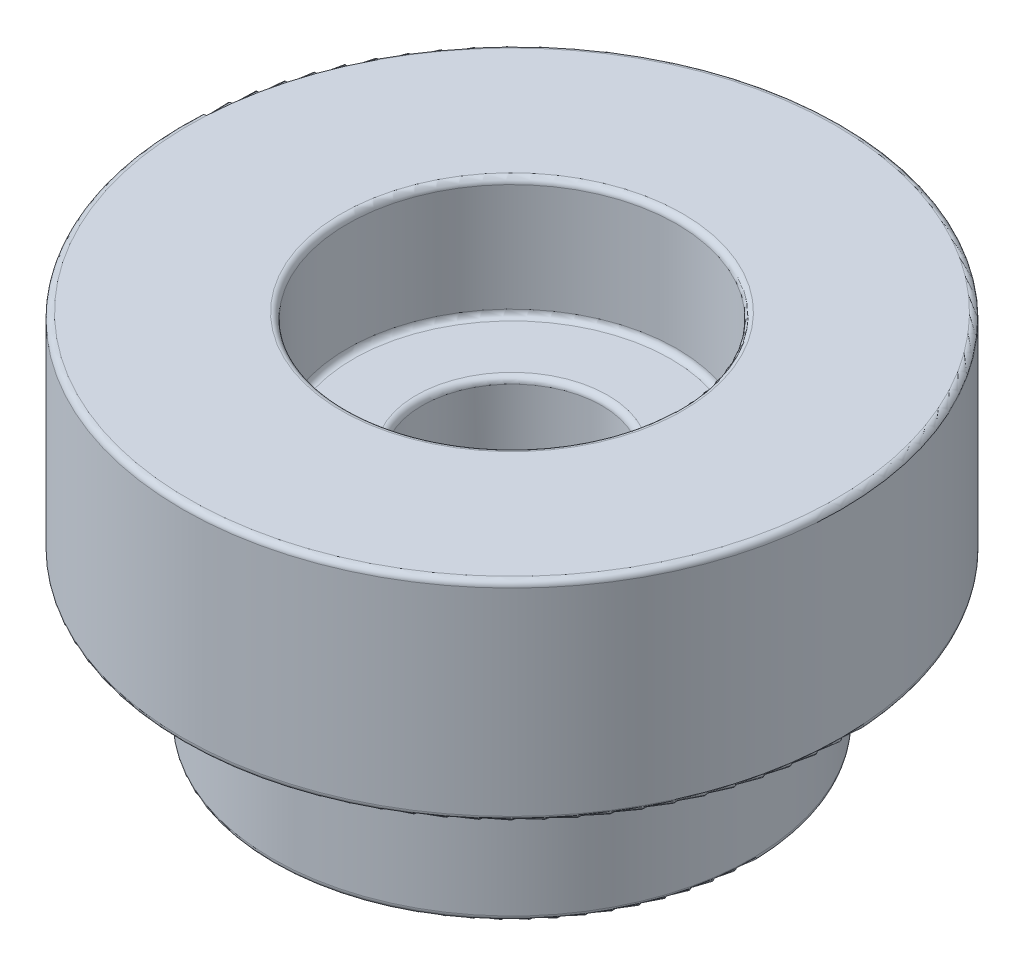
ISO-10303-21;
HEADER;
FILE_DESCRIPTION(('STEP AP214'),'2;1');
FILE_NAME('part.step','',(''),(''),'','','');
FILE_SCHEMA(('AUTOMOTIVE_DESIGN { 1 0 10303 214 1 1 1 1 }'));
ENDSEC;
DATA;
#1=APPLICATION_CONTEXT('core data for automotive mechanical design processes');
#2=APPLICATION_PROTOCOL_DEFINITION('international standard','automotive_design',2000,#1);
#3=PRODUCT_CONTEXT('',#1,'mechanical');
#4=PRODUCT('Part','Part','',(#3));
#5=PRODUCT_RELATED_PRODUCT_CATEGORY('part','',(#4));
#6=PRODUCT_DEFINITION_FORMATION('','',#4);
#7=PRODUCT_DEFINITION_CONTEXT('part definition',#1,'design');
#8=PRODUCT_DEFINITION('design','',#6,#7);
#9=PRODUCT_DEFINITION_SHAPE('','',#8);
#10=(LENGTH_UNIT() NAMED_UNIT(*) SI_UNIT(.MILLI.,.METRE.));
#11=(NAMED_UNIT(*) PLANE_ANGLE_UNIT() SI_UNIT($,.RADIAN.));
#12=(NAMED_UNIT(*) SI_UNIT($,.STERADIAN.) SOLID_ANGLE_UNIT());
#13=UNCERTAINTY_MEASURE_WITH_UNIT(LENGTH_MEASURE(1.E-05),#10,'distance_accuracy_value','');
#14=(GEOMETRIC_REPRESENTATION_CONTEXT(3) GLOBAL_UNCERTAINTY_ASSIGNED_CONTEXT((#13)) GLOBAL_UNIT_ASSIGNED_CONTEXT((#10,
#11,#12)) REPRESENTATION_CONTEXT('',''));
#15=CARTESIAN_POINT('',(0.,0.,0.));
#16=DIRECTION('',(0.,0.,1.));
#17=DIRECTION('',(1.,0.,0.));
#18=AXIS2_PLACEMENT_3D('',#15,#16,#17);
#19=CARTESIAN_POINT('',(0.,0.,0.));
#20=DIRECTION('',(0.,1.,0.));
#21=DIRECTION('',(0.,0.,1.));
#22=AXIS2_PLACEMENT_3D('',#19,#20,#21);
#23=CYLINDRICAL_SURFACE('',#22,4.);
#24=CARTESIAN_POINT('',(0.,0.1,0.));
#25=DIRECTION('',(0.,1.,0.));
#26=DIRECTION('',(0.,0.,1.));
#27=AXIS2_PLACEMENT_3D('',#24,#25,#26);
#28=CIRCLE('',#27,4.);
#29=CARTESIAN_POINT('',(0.,0.1,4.));
#30=VERTEX_POINT('',#29);
#31=EDGE_CURVE('E40',#30,#30,#28,.T.);
#32=ORIENTED_EDGE('',*,*,#31,.T.);
#33=EDGE_LOOP('',(#32));
#34=FACE_BOUND('',#33,.T.);
#35=CARTESIAN_POINT('',(0.,2.4,0.));
#36=DIRECTION('',(0.,1.,0.));
#37=DIRECTION('',(0.,0.,1.));
#38=AXIS2_PLACEMENT_3D('',#35,#36,#37);
#39=CIRCLE('',#38,4.);
#40=CARTESIAN_POINT('',(0.,2.4,4.));
#41=VERTEX_POINT('',#40);
#42=EDGE_CURVE('E43',#41,#41,#39,.F.);
#43=ORIENTED_EDGE('',*,*,#42,.T.);
#44=EDGE_LOOP('',(#43));
#45=FACE_BOUND('',#44,.T.);
#46=ADVANCED_FACE('F14',(#34,#45),#23,.T.);
#47=CARTESIAN_POINT('',(2.75,0.,0.));
#48=DIRECTION('',(0.,1.,0.));
#49=DIRECTION('',(0.,0.,1.));
#50=AXIS2_PLACEMENT_3D('',#47,#48,#49);
#51=PLANE('',#50);
#52=CARTESIAN_POINT('',(0.,0.,0.));
#53=DIRECTION('',(0.,1.,0.));
#54=DIRECTION('',(0.,0.,1.));
#55=AXIS2_PLACEMENT_3D('',#52,#53,#54);
#56=CIRCLE('',#55,2.85);
#57=CARTESIAN_POINT('',(0.,0.,2.85));
#58=VERTEX_POINT('',#57);
#59=EDGE_CURVE('E46',#58,#58,#56,.T.);
#60=ORIENTED_EDGE('',*,*,#59,.T.);
#61=EDGE_LOOP('',(#60));
#62=FACE_BOUND('',#61,.T.);
#63=CARTESIAN_POINT('',(0.,0.,0.));
#64=DIRECTION('',(0.,1.,0.));
#65=DIRECTION('',(0.,0.,1.));
#66=AXIS2_PLACEMENT_3D('',#63,#64,#65);
#67=CIRCLE('',#66,3.9);
#68=CARTESIAN_POINT('',(0.,0.,3.9));
#69=VERTEX_POINT('',#68);
#70=EDGE_CURVE('E49',#69,#69,#67,.F.);
#71=ORIENTED_EDGE('',*,*,#70,.T.);
#72=EDGE_LOOP('',(#71));
#73=FACE_BOUND('',#72,.T.);
#74=ADVANCED_FACE('F96',(#62,#73),#51,.F.);
#75=CARTESIAN_POINT('',(0.,0.,0.));
#76=DIRECTION('',(0.,1.,0.));
#77=DIRECTION('',(0.,0.,1.));
#78=AXIS2_PLACEMENT_3D('',#75,#76,#77);
#79=CYLINDRICAL_SURFACE('',#78,2.75);
#80=CARTESIAN_POINT('',(0.,1.9,0.));
#81=DIRECTION('',(0.,1.,0.));
#82=DIRECTION('',(0.,0.,1.));
#83=AXIS2_PLACEMENT_3D('',#80,#81,#82);
#84=CIRCLE('',#83,2.75);
#85=CARTESIAN_POINT('',(0.,1.9,2.75));
#86=VERTEX_POINT('',#85);
#87=EDGE_CURVE('E64',#86,#86,#84,.T.);
#88=ORIENTED_EDGE('',*,*,#87,.T.);
#89=EDGE_LOOP('',(#88));
#90=FACE_BOUND('',#89,.T.);
#91=CARTESIAN_POINT('',(0.,0.1,0.));
#92=DIRECTION('',(0.,1.,0.));
#93=DIRECTION('',(0.,0.,1.));
#94=AXIS2_PLACEMENT_3D('',#91,#92,#93);
#95=CIRCLE('',#94,2.75);
#96=CARTESIAN_POINT('',(0.,0.1,2.75));
#97=VERTEX_POINT('',#96);
#98=EDGE_CURVE('E67',#97,#97,#95,.F.);
#99=ORIENTED_EDGE('',*,*,#98,.T.);
#100=EDGE_LOOP('',(#99));
#101=FACE_BOUND('',#100,.T.);
#102=ADVANCED_FACE('F93',(#90,#101),#79,.F.);
#103=CARTESIAN_POINT('',(1.5,2.,0.));
#104=DIRECTION('',(0.,1.,0.));
#105=DIRECTION('',(0.,0.,1.));
#106=AXIS2_PLACEMENT_3D('',#103,#104,#105);
#107=PLANE('',#106);
#108=CARTESIAN_POINT('',(0.,2.,0.));
#109=DIRECTION('',(0.,1.,0.));
#110=DIRECTION('',(0.,0.,1.));
#111=AXIS2_PLACEMENT_3D('',#108,#109,#110);
#112=CIRCLE('',#111,1.6);
#113=CARTESIAN_POINT('',(0.,2.,1.6));
#114=VERTEX_POINT('',#113);
#115=EDGE_CURVE('E76',#114,#114,#112,.T.);
#116=ORIENTED_EDGE('',*,*,#115,.T.);
#117=EDGE_LOOP('',(#116));
#118=FACE_BOUND('',#117,.T.);
#119=CARTESIAN_POINT('',(0.,2.,0.));
#120=DIRECTION('',(0.,1.,0.));
#121=DIRECTION('',(0.,0.,1.));
#122=AXIS2_PLACEMENT_3D('',#119,#120,#121);
#123=CIRCLE('',#122,2.65);
#124=CARTESIAN_POINT('',(0.,2.,2.65));
#125=VERTEX_POINT('',#124);
#126=EDGE_CURVE('E79',#125,#125,#123,.F.);
#127=ORIENTED_EDGE('',*,*,#126,.T.);
#128=EDGE_LOOP('',(#127));
#129=FACE_BOUND('',#128,.T.);
#130=ADVANCED_FACE('F83',(#118,#129),#107,.F.);
#131=CARTESIAN_POINT('',(0.,0.,0.));
#132=DIRECTION('',(0.,1.,0.));
#133=DIRECTION('',(0.,0.,1.));
#134=AXIS2_PLACEMENT_3D('',#131,#132,#133);
#135=CYLINDRICAL_SURFACE('',#134,1.5);
#136=CARTESIAN_POINT('',(0.,2.1,0.));
#137=DIRECTION('',(0.,1.,0.));
#138=DIRECTION('',(0.,0.,1.));
#139=AXIS2_PLACEMENT_3D('',#136,#137,#138);
#140=CIRCLE('',#139,1.5);
#141=CARTESIAN_POINT('',(0.,2.1,1.5));
#142=VERTEX_POINT('',#141);
#143=EDGE_CURVE('E70',#142,#142,#140,.F.);
#144=ORIENTED_EDGE('',*,*,#143,.T.);
#145=EDGE_LOOP('',(#144));
#146=FACE_BOUND('',#145,.T.);
#147=CARTESIAN_POINT('',(0.,3.9,0.));
#148=DIRECTION('',(0.,-1.,0.));
#149=DIRECTION('',(0.,0.,-1.));
#150=AXIS2_PLACEMENT_3D('',#147,#148,#149);
#151=CIRCLE('',#150,1.5);
#152=CARTESIAN_POINT('',(0.,3.9,-1.5));
#153=VERTEX_POINT('',#152);
#154=EDGE_CURVE('E73',#153,#153,#151,.F.);
#155=ORIENTED_EDGE('',*,*,#154,.T.);
#156=EDGE_LOOP('',(#155));
#157=FACE_BOUND('',#156,.T.);
#158=ADVANCED_FACE('F169',(#146,#157),#135,.F.);
#159=CARTESIAN_POINT('',(2.75,4.,0.));
#160=DIRECTION('',(0.,-1.,0.));
#161=DIRECTION('',(0.,0.,-1.));
#162=AXIS2_PLACEMENT_3D('',#159,#160,#161);
#163=PLANE('',#162);
#164=CARTESIAN_POINT('',(0.,4.,0.));
#165=DIRECTION('',(0.,-1.,0.));
#166=DIRECTION('',(0.,0.,-1.));
#167=AXIS2_PLACEMENT_3D('',#164,#165,#166);
#168=CIRCLE('',#167,2.65);
#169=CARTESIAN_POINT('',(0.,4.,-2.65));
#170=VERTEX_POINT('',#169);
#171=EDGE_CURVE('E58',#170,#170,#168,.F.);
#172=ORIENTED_EDGE('',*,*,#171,.T.);
#173=EDGE_LOOP('',(#172));
#174=FACE_BOUND('',#173,.T.);
#175=CARTESIAN_POINT('',(0.,4.,0.));
#176=DIRECTION('',(0.,-1.,0.));
#177=DIRECTION('',(0.,0.,-1.));
#178=AXIS2_PLACEMENT_3D('',#175,#176,#177);
#179=CIRCLE('',#178,1.6);
#180=CARTESIAN_POINT('',(0.,4.,-1.6));
#181=VERTEX_POINT('',#180);
#182=EDGE_CURVE('E61',#181,#181,#179,.T.);
#183=ORIENTED_EDGE('',*,*,#182,.T.);
#184=EDGE_LOOP('',(#183));
#185=FACE_BOUND('',#184,.T.);
#186=ADVANCED_FACE('F173',(#174,#185),#163,.F.);
#187=CARTESIAN_POINT('',(0.,0.,0.));
#188=DIRECTION('',(0.,1.,0.));
#189=DIRECTION('',(0.,0.,1.));
#190=AXIS2_PLACEMENT_3D('',#187,#188,#189);
#191=CYLINDRICAL_SURFACE('',#190,2.75);
#192=CARTESIAN_POINT('',(0.,4.1,0.));
#193=DIRECTION('',(0.,-1.,0.));
#194=DIRECTION('',(0.,0.,-1.));
#195=AXIS2_PLACEMENT_3D('',#192,#193,#194);
#196=CIRCLE('',#195,2.75);
#197=CARTESIAN_POINT('',(0.,4.1,-2.75));
#198=VERTEX_POINT('',#197);
#199=EDGE_CURVE('E52',#198,#198,#196,.T.);
#200=ORIENTED_EDGE('',*,*,#199,.T.);
#201=EDGE_LOOP('',(#200));
#202=FACE_BOUND('',#201,.T.);
#203=CARTESIAN_POINT('',(0.,5.9,0.));
#204=DIRECTION('',(0.,-1.,0.));
#205=DIRECTION('',(0.,0.,-1.));
#206=AXIS2_PLACEMENT_3D('',#203,#204,#205);
#207=CIRCLE('',#206,2.75);
#208=CARTESIAN_POINT('',(0.,5.9,-2.75));
#209=VERTEX_POINT('',#208);
#210=EDGE_CURVE('E55',#209,#209,#207,.F.);
#211=ORIENTED_EDGE('',*,*,#210,.T.);
#212=EDGE_LOOP('',(#211));
#213=FACE_BOUND('',#212,.T.);
#214=ADVANCED_FACE('F177',(#202,#213),#191,.F.);
#215=CARTESIAN_POINT('',(5.5,6.,0.));
#216=DIRECTION('',(0.,-1.,0.));
#217=DIRECTION('',(0.,0.,-1.));
#218=AXIS2_PLACEMENT_3D('',#215,#216,#217);
#219=PLANE('',#218);
#220=CARTESIAN_POINT('',(0.,6.,0.));
#221=DIRECTION('',(0.,-1.,0.));
#222=DIRECTION('',(0.,0.,-1.));
#223=AXIS2_PLACEMENT_3D('',#220,#221,#222);
#224=CIRCLE('',#223,5.4);
#225=CARTESIAN_POINT('',(0.,6.,-5.4));
#226=VERTEX_POINT('',#225);
#227=EDGE_CURVE('E10',#226,#226,#224,.F.);
#228=ORIENTED_EDGE('',*,*,#227,.T.);
#229=EDGE_LOOP('',(#228));
#230=FACE_BOUND('',#229,.T.);
#231=CARTESIAN_POINT('',(0.,6.,0.));
#232=DIRECTION('',(0.,-1.,0.));
#233=DIRECTION('',(0.,0.,-1.));
#234=AXIS2_PLACEMENT_3D('',#231,#232,#233);
#235=CIRCLE('',#234,2.85);
#236=CARTESIAN_POINT('',(0.,6.,-2.85));
#237=VERTEX_POINT('',#236);
#238=EDGE_CURVE('E21',#237,#237,#235,.T.);
#239=ORIENTED_EDGE('',*,*,#238,.T.);
#240=EDGE_LOOP('',(#239));
#241=FACE_BOUND('',#240,.T.);
#242=ADVANCED_FACE('F145',(#230,#241),#219,.F.);
#243=CARTESIAN_POINT('',(0.,0.,0.));
#244=DIRECTION('',(0.,1.,0.));
#245=DIRECTION('',(0.,0.,1.));
#246=AXIS2_PLACEMENT_3D('',#243,#244,#245);
#247=CYLINDRICAL_SURFACE('',#246,5.5);
#248=CARTESIAN_POINT('',(0.,2.6,0.));
#249=DIRECTION('',(0.,1.,0.));
#250=DIRECTION('',(0.,0.,1.));
#251=AXIS2_PLACEMENT_3D('',#248,#249,#250);
#252=CIRCLE('',#251,5.5);
#253=CARTESIAN_POINT('',(0.,2.6,5.5));
#254=VERTEX_POINT('',#253);
#255=EDGE_CURVE('E25',#254,#254,#252,.T.);
#256=ORIENTED_EDGE('',*,*,#255,.T.);
#257=EDGE_LOOP('',(#256));
#258=FACE_BOUND('',#257,.T.);
#259=CARTESIAN_POINT('',(0.,5.9,0.));
#260=DIRECTION('',(0.,-1.,0.));
#261=DIRECTION('',(0.,0.,-1.));
#262=AXIS2_PLACEMENT_3D('',#259,#260,#261);
#263=CIRCLE('',#262,5.5);
#264=CARTESIAN_POINT('',(0.,5.9,-5.5));
#265=VERTEX_POINT('',#264);
#266=EDGE_CURVE('E29',#265,#265,#263,.T.);
#267=ORIENTED_EDGE('',*,*,#266,.T.);
#268=EDGE_LOOP('',(#267));
#269=FACE_BOUND('',#268,.T.);
#270=ADVANCED_FACE('F133',(#258,#269),#247,.T.);
#271=CARTESIAN_POINT('',(4.,2.5,0.));
#272=DIRECTION('',(0.,1.,0.));
#273=DIRECTION('',(0.,0.,1.));
#274=AXIS2_PLACEMENT_3D('',#271,#272,#273);
#275=PLANE('',#274);
#276=CARTESIAN_POINT('',(0.,2.5,0.));
#277=DIRECTION('',(0.,1.,0.));
#278=DIRECTION('',(0.,0.,1.));
#279=AXIS2_PLACEMENT_3D('',#276,#277,#278);
#280=CIRCLE('',#279,4.1);
#281=CARTESIAN_POINT('',(0.,2.5,4.1));
#282=VERTEX_POINT('',#281);
#283=EDGE_CURVE('E34',#282,#282,#280,.T.);
#284=ORIENTED_EDGE('',*,*,#283,.T.);
#285=EDGE_LOOP('',(#284));
#286=FACE_BOUND('',#285,.T.);
#287=CARTESIAN_POINT('',(0.,2.5,0.));
#288=DIRECTION('',(0.,1.,0.));
#289=DIRECTION('',(0.,0.,1.));
#290=AXIS2_PLACEMENT_3D('',#287,#288,#289);
#291=CIRCLE('',#290,5.4);
#292=CARTESIAN_POINT('',(0.,2.5,5.4));
#293=VERTEX_POINT('',#292);
#294=EDGE_CURVE('E37',#293,#293,#291,.F.);
#295=ORIENTED_EDGE('',*,*,#294,.T.);
#296=EDGE_LOOP('',(#295));
#297=FACE_BOUND('',#296,.T.);
#298=ADVANCED_FACE('F130',(#286,#297),#275,.F.);
#299=CARTESIAN_POINT('',(0.,2.1,0.));
#300=DIRECTION('',(0.,1.,0.));
#301=DIRECTION('',(0.,0.,1.));
#302=AXIS2_PLACEMENT_3D('',#299,#300,#301);
#303=TOROIDAL_SURFACE('',#302,1.6,0.1);
#304=ORIENTED_EDGE('',*,*,#143,.F.);
#305=EDGE_LOOP('',(#304));
#306=FACE_BOUND('',#305,.T.);
#307=ORIENTED_EDGE('',*,*,#115,.F.);
#308=EDGE_LOOP('',(#307));
#309=FACE_BOUND('',#308,.T.);
#310=ADVANCED_FACE('F89',(#306,#309),#303,.T.);
#311=CARTESIAN_POINT('',(0.,1.9,0.));
#312=DIRECTION('',(0.,1.,0.));
#313=DIRECTION('',(0.,0.,1.));
#314=AXIS2_PLACEMENT_3D('',#311,#312,#313);
#315=TOROIDAL_SURFACE('',#314,2.65,0.1);
#316=ORIENTED_EDGE('',*,*,#126,.F.);
#317=EDGE_LOOP('',(#316));
#318=FACE_BOUND('',#317,.T.);
#319=ORIENTED_EDGE('',*,*,#87,.F.);
#320=EDGE_LOOP('',(#319));
#321=FACE_BOUND('',#320,.T.);
#322=ADVANCED_FACE('F85',(#318,#321),#315,.F.);
#323=CARTESIAN_POINT('',(0.,4.1,0.));
#324=DIRECTION('',(0.,-1.,0.));
#325=DIRECTION('',(0.,0.,-1.));
#326=AXIS2_PLACEMENT_3D('',#323,#324,#325);
#327=TOROIDAL_SURFACE('',#326,2.65,0.1);
#328=ORIENTED_EDGE('',*,*,#199,.F.);
#329=EDGE_LOOP('',(#328));
#330=FACE_BOUND('',#329,.T.);
#331=ORIENTED_EDGE('',*,*,#171,.F.);
#332=EDGE_LOOP('',(#331));
#333=FACE_BOUND('',#332,.T.);
#334=ADVANCED_FACE('F88',(#330,#333),#327,.F.);
#335=CARTESIAN_POINT('',(0.,3.9,0.));
#336=DIRECTION('',(0.,-1.,0.));
#337=DIRECTION('',(0.,0.,-1.));
#338=AXIS2_PLACEMENT_3D('',#335,#336,#337);
#339=TOROIDAL_SURFACE('',#338,1.6,0.1);
#340=ORIENTED_EDGE('',*,*,#182,.F.);
#341=EDGE_LOOP('',(#340));
#342=FACE_BOUND('',#341,.T.);
#343=ORIENTED_EDGE('',*,*,#154,.F.);
#344=EDGE_LOOP('',(#343));
#345=FACE_BOUND('',#344,.T.);
#346=ADVANCED_FACE('F104',(#342,#345),#339,.T.);
#347=CARTESIAN_POINT('',(0.,0.1,0.));
#348=DIRECTION('',(0.,1.,0.));
#349=DIRECTION('',(0.,0.,1.));
#350=AXIS2_PLACEMENT_3D('',#347,#348,#349);
#351=TOROIDAL_SURFACE('',#350,2.85,0.1);
#352=ORIENTED_EDGE('',*,*,#98,.F.);
#353=EDGE_LOOP('',(#352));
#354=FACE_BOUND('',#353,.T.);
#355=ORIENTED_EDGE('',*,*,#59,.F.);
#356=EDGE_LOOP('',(#355));
#357=FACE_BOUND('',#356,.T.);
#358=ADVANCED_FACE('F100',(#354,#357),#351,.T.);
#359=CARTESIAN_POINT('',(0.,0.1,0.));
#360=DIRECTION('',(0.,1.,0.));
#361=DIRECTION('',(0.,0.,1.));
#362=AXIS2_PLACEMENT_3D('',#359,#360,#361);
#363=TOROIDAL_SURFACE('',#362,3.9,0.1);
#364=ORIENTED_EDGE('',*,*,#70,.F.);
#365=EDGE_LOOP('',(#364));
#366=FACE_BOUND('',#365,.T.);
#367=ORIENTED_EDGE('',*,*,#31,.F.);
#368=EDGE_LOOP('',(#367));
#369=FACE_BOUND('',#368,.T.);
#370=ADVANCED_FACE('F103',(#366,#369),#363,.T.);
#371=CARTESIAN_POINT('',(0.,2.4,0.));
#372=DIRECTION('',(0.,1.,0.));
#373=DIRECTION('',(0.,0.,1.));
#374=AXIS2_PLACEMENT_3D('',#371,#372,#373);
#375=TOROIDAL_SURFACE('',#374,4.1,0.1);
#376=ORIENTED_EDGE('',*,*,#42,.F.);
#377=EDGE_LOOP('',(#376));
#378=FACE_BOUND('',#377,.T.);
#379=ORIENTED_EDGE('',*,*,#283,.F.);
#380=EDGE_LOOP('',(#379));
#381=FACE_BOUND('',#380,.T.);
#382=ADVANCED_FACE('F115',(#378,#381),#375,.F.);
#383=CARTESIAN_POINT('',(0.,2.6,0.));
#384=DIRECTION('',(0.,1.,0.));
#385=DIRECTION('',(0.,0.,1.));
#386=AXIS2_PLACEMENT_3D('',#383,#384,#385);
#387=TOROIDAL_SURFACE('',#386,5.4,0.1);
#388=ORIENTED_EDGE('',*,*,#294,.F.);
#389=EDGE_LOOP('',(#388));
#390=FACE_BOUND('',#389,.T.);
#391=ORIENTED_EDGE('',*,*,#255,.F.);
#392=EDGE_LOOP('',(#391));
#393=FACE_BOUND('',#392,.T.);
#394=ADVANCED_FACE('F126',(#390,#393),#387,.T.);
#395=CARTESIAN_POINT('',(0.,5.9,0.));
#396=DIRECTION('',(0.,-1.,0.));
#397=DIRECTION('',(0.,0.,-1.));
#398=AXIS2_PLACEMENT_3D('',#395,#396,#397);
#399=TOROIDAL_SURFACE('',#398,5.4,0.1);
#400=ORIENTED_EDGE('',*,*,#266,.F.);
#401=EDGE_LOOP('',(#400));
#402=FACE_BOUND('',#401,.T.);
#403=ORIENTED_EDGE('',*,*,#227,.F.);
#404=EDGE_LOOP('',(#403));
#405=FACE_BOUND('',#404,.T.);
#406=ADVANCED_FACE('F139',(#402,#405),#399,.T.);
#407=CARTESIAN_POINT('',(0.,5.9,0.));
#408=DIRECTION('',(0.,-1.,0.));
#409=DIRECTION('',(0.,0.,-1.));
#410=AXIS2_PLACEMENT_3D('',#407,#408,#409);
#411=TOROIDAL_SURFACE('',#410,2.85,0.1);
#412=ORIENTED_EDGE('',*,*,#238,.F.);
#413=EDGE_LOOP('',(#412));
#414=FACE_BOUND('',#413,.T.);
#415=ORIENTED_EDGE('',*,*,#210,.F.);
#416=EDGE_LOOP('',(#415));
#417=FACE_BOUND('',#416,.T.);
#418=ADVANCED_FACE('F16',(#414,#417),#411,.T.);
#419=CLOSED_SHELL('',(#46,#74,#102,#130,#158,#186,#214,#242,#270,#298,#310,#322,#334,#346,#358,
#370,#382,#394,#406,#418));
#420=MANIFOLD_SOLID_BREP('B1',#419);
#421=ADVANCED_BREP_SHAPE_REPRESENTATION('',(#18,#420),#14);
#422=SHAPE_DEFINITION_REPRESENTATION(#9,#421);
ENDSEC;
END-ISO-10303-21;
